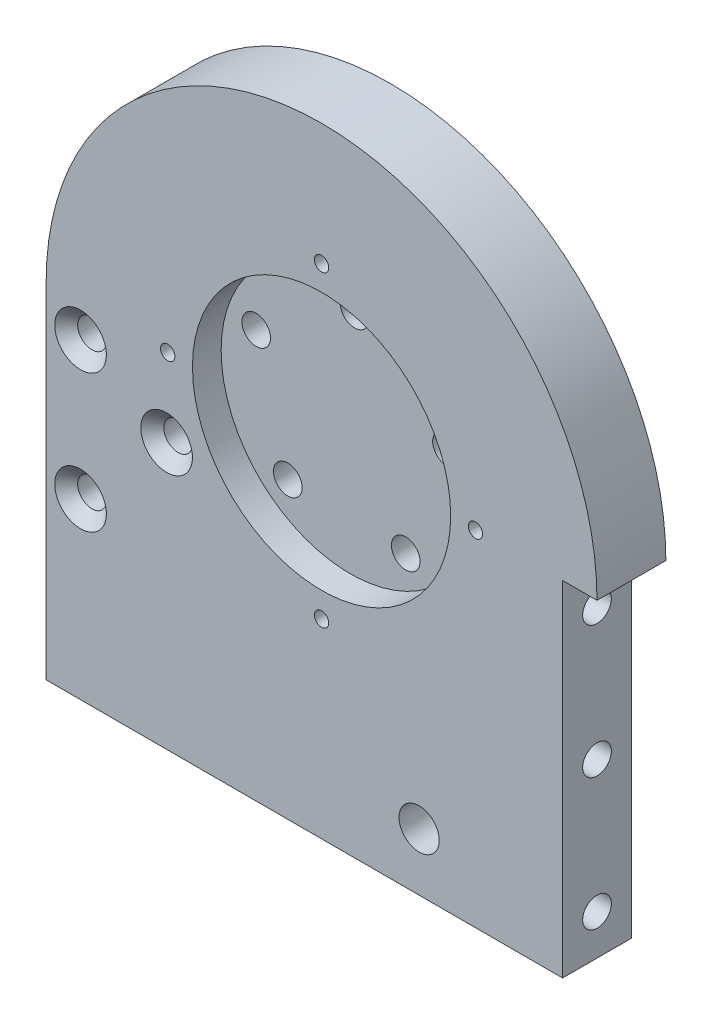
ISO-10303-21;
HEADER;
FILE_DESCRIPTION(('STEP AP214'),'2;1');
FILE_NAME('part.step','',(''),(''),'','','');
FILE_SCHEMA(('AUTOMOTIVE_DESIGN { 1 0 10303 214 1 1 1 1 }'));
ENDSEC;
DATA;
#1=APPLICATION_CONTEXT('core data for automotive mechanical design processes');
#2=APPLICATION_PROTOCOL_DEFINITION('international standard','automotive_design',2000,#1);
#3=PRODUCT_CONTEXT('',#1,'mechanical');
#4=PRODUCT('Part','Part','',(#3));
#5=PRODUCT_RELATED_PRODUCT_CATEGORY('part','',(#4));
#6=PRODUCT_DEFINITION_FORMATION('','',#4);
#7=PRODUCT_DEFINITION_CONTEXT('part definition',#1,'design');
#8=PRODUCT_DEFINITION('design','',#6,#7);
#9=PRODUCT_DEFINITION_SHAPE('','',#8);
#10=(LENGTH_UNIT() NAMED_UNIT(*) SI_UNIT(.MILLI.,.METRE.));
#11=(NAMED_UNIT(*) PLANE_ANGLE_UNIT() SI_UNIT($,.RADIAN.));
#12=(NAMED_UNIT(*) SI_UNIT($,.STERADIAN.) SOLID_ANGLE_UNIT());
#13=UNCERTAINTY_MEASURE_WITH_UNIT(LENGTH_MEASURE(1.E-05),#10,'distance_accuracy_value','');
#14=(GEOMETRIC_REPRESENTATION_CONTEXT(3) GLOBAL_UNCERTAINTY_ASSIGNED_CONTEXT((#13)) GLOBAL_UNIT_ASSIGNED_CONTEXT((#10,
#11,#12)) REPRESENTATION_CONTEXT('',''));
#15=CARTESIAN_POINT('',(0.,0.,0.));
#16=DIRECTION('',(0.,0.,1.));
#17=DIRECTION('',(1.,0.,0.));
#18=AXIS2_PLACEMENT_3D('',#15,#16,#17);
#19=CARTESIAN_POINT('',(2.99999999999998,30.,12.));
#20=DIRECTION('',(0.,0.,-1.));
#21=DIRECTION('',(-1.,0.,0.));
#22=AXIS2_PLACEMENT_3D('',#19,#20,#21);
#23=PLANE('',#22);
#24=CARTESIAN_POINT('',(20.,-20.,12.));
#25=DIRECTION('',(0.,0.,1.));
#26=DIRECTION('',(1.,0.,0.));
#27=AXIS2_PLACEMENT_3D('',#24,#25,#26);
#28=CIRCLE('',#27,3.5);
#29=CARTESIAN_POINT('',(23.5,-20.,12.));
#30=VERTEX_POINT('',#29);
#31=EDGE_CURVE('E134',#30,#30,#28,.T.);
#32=ORIENTED_EDGE('',*,*,#31,.F.);
#33=EDGE_LOOP('',(#32));
#34=FACE_BOUND('',#33,.T.);
#35=CARTESIAN_POINT('',(-23.8135681500049,29.9999999999999,12.));
#36=DIRECTION('',(0.,0.,1.));
#37=DIRECTION('',(0.,1.,0.));
#38=AXIS2_PLACEMENT_3D('',#35,#36,#37);
#39=CIRCLE('',#38,1.25);
#40=CARTESIAN_POINT('',(-23.813568150005,31.2499999999999,12.));
#41=VERTEX_POINT('',#40);
#42=EDGE_CURVE('E469',#41,#41,#39,.T.);
#43=ORIENTED_EDGE('',*,*,#42,.F.);
#44=EDGE_LOOP('',(#43));
#45=FACE_BOUND('',#44,.T.);
#46=CARTESIAN_POINT('',(2.99999999999998,3.18643184999511,12.));
#47=DIRECTION('',(0.,0.,1.));
#48=DIRECTION('',(-1.,0.,0.));
#49=AXIS2_PLACEMENT_3D('',#46,#47,#48);
#50=CIRCLE('',#49,1.25);
#51=CARTESIAN_POINT('',(1.74999999999998,3.18643184999511,12.));
#52=VERTEX_POINT('',#51);
#53=EDGE_CURVE('E475',#52,#52,#50,.T.);
#54=ORIENTED_EDGE('',*,*,#53,.F.);
#55=EDGE_LOOP('',(#54));
#56=FACE_BOUND('',#55,.T.);
#57=CARTESIAN_POINT('',(29.8135681500049,30.0000000000003,12.));
#58=DIRECTION('',(0.,0.,1.));
#59=DIRECTION('',(0.,-1.,0.));
#60=AXIS2_PLACEMENT_3D('',#57,#58,#59);
#61=CIRCLE('',#60,1.25);
#62=CARTESIAN_POINT('',(29.8135681500049,28.7500000000003,12.));
#63=VERTEX_POINT('',#62);
#64=EDGE_CURVE('E133',#63,#63,#61,.T.);
#65=ORIENTED_EDGE('',*,*,#64,.F.);
#66=EDGE_LOOP('',(#65));
#67=FACE_BOUND('',#66,.T.);
#68=CARTESIAN_POINT('',(2.99999999999998,56.8135681500049,12.));
#69=DIRECTION('',(0.,0.,1.));
#70=DIRECTION('',(1.,0.,0.));
#71=AXIS2_PLACEMENT_3D('',#68,#69,#70);
#72=CIRCLE('',#71,1.25);
#73=CARTESIAN_POINT('',(4.24999999999998,56.8135681500049,12.));
#74=VERTEX_POINT('',#73);
#75=EDGE_CURVE('E468',#74,#74,#72,.T.);
#76=ORIENTED_EDGE('',*,*,#75,.F.);
#77=EDGE_LOOP('',(#76));
#78=FACE_BOUND('',#77,.T.);
#79=CARTESIAN_POINT('',(2.99999999999998,30.,12.));
#80=DIRECTION('',(0.,0.,1.));
#81=DIRECTION('',(1.,0.,0.));
#82=AXIS2_PLACEMENT_3D('',#79,#80,#81);
#83=CIRCLE('',#82,22.5);
#84=CARTESIAN_POINT('',(25.5,30.,12.));
#85=VERTEX_POINT('',#84);
#86=EDGE_CURVE('E516',#85,#85,#83,.T.);
#87=ORIENTED_EDGE('',*,*,#86,.F.);
#88=EDGE_LOOP('',(#87));
#89=FACE_BOUND('',#88,.T.);
#90=DIRECTION('',(0.,1.,0.));
#91=VECTOR('',#90,1.);
#92=CARTESIAN_POINT('',(45.,-30.,12.));
#93=LINE('',#92,#91);
#94=CARTESIAN_POINT('',(45.,-30.,12.));
#95=VERTEX_POINT('',#94);
#96=CARTESIAN_POINT('',(45.,30.,12.));
#97=VERTEX_POINT('',#96);
#98=EDGE_CURVE('E125',#95,#97,#93,.T.);
#99=ORIENTED_EDGE('',*,*,#98,.T.);
#100=DIRECTION('',(1.,0.,0.));
#101=VECTOR('',#100,1.);
#102=CARTESIAN_POINT('',(45.,30.,12.));
#103=LINE('',#102,#101);
#104=CARTESIAN_POINT('',(51.,30.,12.));
#105=VERTEX_POINT('',#104);
#106=EDGE_CURVE('E91',#97,#105,#103,.T.);
#107=ORIENTED_EDGE('',*,*,#106,.T.);
#108=CARTESIAN_POINT('',(2.99999999999998,30.,12.));
#109=DIRECTION('',(0.,0.,1.));
#110=DIRECTION('',(-1.,0.,0.));
#111=AXIS2_PLACEMENT_3D('',#108,#109,#110);
#112=CIRCLE('',#111,48.);
#113=CARTESIAN_POINT('',(-45.,30.,12.));
#114=VERTEX_POINT('',#113);
#115=EDGE_CURVE('E95',#105,#114,#112,.T.);
#116=ORIENTED_EDGE('',*,*,#115,.T.);
#117=DIRECTION('',(0.,-1.,0.));
#118=VECTOR('',#117,1.);
#119=CARTESIAN_POINT('',(-45.,-30.,12.));
#120=LINE('',#119,#118);
#121=CARTESIAN_POINT('',(-45.,-30.,12.));
#122=VERTEX_POINT('',#121);
#123=EDGE_CURVE('E99',#114,#122,#120,.T.);
#124=ORIENTED_EDGE('',*,*,#123,.T.);
#125=DIRECTION('',(1.,0.,0.));
#126=VECTOR('',#125,1.);
#127=CARTESIAN_POINT('',(-45.,-30.,12.));
#128=LINE('',#127,#126);
#129=EDGE_CURVE('E56',#122,#95,#128,.T.);
#130=ORIENTED_EDGE('',*,*,#129,.T.);
#131=EDGE_LOOP('',(#99,#107,#116,#124,#130));
#132=FACE_BOUND('',#131,.T.);
#133=CARTESIAN_POINT('',(-24.,16.3,12.));
#134=DIRECTION('',(0.,0.,1.));
#135=DIRECTION('',(1.,0.,0.));
#136=AXIS2_PLACEMENT_3D('',#133,#134,#135);
#137=CIRCLE('',#136,4.5);
#138=CARTESIAN_POINT('',(-19.5,16.3,12.));
#139=VERTEX_POINT('',#138);
#140=EDGE_CURVE('E430',#139,#139,#137,.T.);
#141=ORIENTED_EDGE('',*,*,#140,.F.);
#142=EDGE_LOOP('',(#141));
#143=FACE_BOUND('',#142,.T.);
#144=CARTESIAN_POINT('',(-39.,0.299999999999988,12.));
#145=DIRECTION('',(0.,0.,1.));
#146=DIRECTION('',(1.,0.,0.));
#147=AXIS2_PLACEMENT_3D('',#144,#145,#146);
#148=CIRCLE('',#147,4.5);
#149=CARTESIAN_POINT('',(-34.5,0.299999999999988,12.));
#150=VERTEX_POINT('',#149);
#151=EDGE_CURVE('E421',#150,#150,#148,.T.);
#152=ORIENTED_EDGE('',*,*,#151,.F.);
#153=EDGE_LOOP('',(#152));
#154=FACE_BOUND('',#153,.T.);
#155=CARTESIAN_POINT('',(-39.,24.3,12.));
#156=DIRECTION('',(0.,0.,1.));
#157=DIRECTION('',(1.,0.,0.));
#158=AXIS2_PLACEMENT_3D('',#155,#156,#157);
#159=CIRCLE('',#158,4.5);
#160=CARTESIAN_POINT('',(-34.5,24.3,12.));
#161=VERTEX_POINT('',#160);
#162=EDGE_CURVE('E413',#161,#161,#159,.T.);
#163=ORIENTED_EDGE('',*,*,#162,.F.);
#164=EDGE_LOOP('',(#163));
#165=FACE_BOUND('',#164,.T.);
#166=ADVANCED_FACE('F39',(#34,#45,#56,#67,#78,#89,#132,#143,#154,#165),#23,.F.);
#167=CARTESIAN_POINT('',(37.,23.,6.));
#168=DIRECTION('',(1.,0.,0.));
#169=DIRECTION('',(0.,0.,-1.));
#170=AXIS2_PLACEMENT_3D('',#167,#168,#169);
#171=PLANE('',#170);
#172=CARTESIAN_POINT('',(37.,23.,6.));
#173=DIRECTION('',(1.,0.,0.));
#174=DIRECTION('',(0.,0.,-1.));
#175=AXIS2_PLACEMENT_3D('',#172,#173,#174);
#176=CIRCLE('',#175,2.5);
#177=CARTESIAN_POINT('',(37.,23.,3.5));
#178=VERTEX_POINT('',#177);
#179=EDGE_CURVE('E11',#178,#178,#176,.T.);
#180=ORIENTED_EDGE('',*,*,#179,.T.);
#181=EDGE_LOOP('',(#180));
#182=FACE_BOUND('',#181,.T.);
#183=ADVANCED_FACE('F41',(#182),#171,.T.);
#184=CARTESIAN_POINT('',(37.,23.,6.));
#185=DIRECTION('',(1.,0.,0.));
#186=DIRECTION('',(0.,0.,-1.));
#187=AXIS2_PLACEMENT_3D('',#184,#185,#186);
#188=CYLINDRICAL_SURFACE('',#187,2.5);
#189=ORIENTED_EDGE('',*,*,#179,.F.);
#190=EDGE_LOOP('',(#189));
#191=FACE_BOUND('',#190,.T.);
#192=CARTESIAN_POINT('',(45.,23.,6.));
#193=DIRECTION('',(1.,0.,0.));
#194=DIRECTION('',(0.,0.,-1.));
#195=AXIS2_PLACEMENT_3D('',#192,#193,#194);
#196=CIRCLE('',#195,2.5);
#197=CARTESIAN_POINT('',(45.,23.,3.5));
#198=VERTEX_POINT('',#197);
#199=EDGE_CURVE('E48',#198,#198,#196,.T.);
#200=ORIENTED_EDGE('',*,*,#199,.T.);
#201=EDGE_LOOP('',(#200));
#202=FACE_BOUND('',#201,.T.);
#203=ADVANCED_FACE('F138',(#191,#202),#188,.F.);
#204=CARTESIAN_POINT('',(45.,-30.,12.));
#205=DIRECTION('',(-1.,0.,0.));
#206=DIRECTION('',(0.,0.,1.));
#207=AXIS2_PLACEMENT_3D('',#204,#205,#206);
#208=PLANE('',#207);
#209=CARTESIAN_POINT('',(45.,0.,6.));
#210=DIRECTION('',(1.,0.,0.));
#211=DIRECTION('',(0.,0.,-1.));
#212=AXIS2_PLACEMENT_3D('',#209,#210,#211);
#213=CIRCLE('',#212,2.5);
#214=CARTESIAN_POINT('',(45.,0.,3.5));
#215=VERTEX_POINT('',#214);
#216=EDGE_CURVE('E439',#215,#215,#213,.T.);
#217=ORIENTED_EDGE('',*,*,#216,.F.);
#218=EDGE_LOOP('',(#217));
#219=FACE_BOUND('',#218,.T.);
#220=CARTESIAN_POINT('',(45.,-23.,6.));
#221=DIRECTION('',(1.,0.,0.));
#222=DIRECTION('',(0.,0.,-1.));
#223=AXIS2_PLACEMENT_3D('',#220,#221,#222);
#224=CIRCLE('',#223,2.5);
#225=CARTESIAN_POINT('',(45.,-23.,3.5));
#226=VERTEX_POINT('',#225);
#227=EDGE_CURVE('E445',#226,#226,#224,.T.);
#228=ORIENTED_EDGE('',*,*,#227,.F.);
#229=EDGE_LOOP('',(#228));
#230=FACE_BOUND('',#229,.T.);
#231=DIRECTION('',(0.,1.,0.));
#232=VECTOR('',#231,1.);
#233=CARTESIAN_POINT('',(45.,-30.,0.));
#234=LINE('',#233,#232);
#235=CARTESIAN_POINT('',(45.,-30.,0.));
#236=VERTEX_POINT('',#235);
#237=CARTESIAN_POINT('',(45.,30.,0.));
#238=VERTEX_POINT('',#237);
#239=EDGE_CURVE('E116',#236,#238,#234,.T.);
#240=ORIENTED_EDGE('',*,*,#239,.T.);
#241=DIRECTION('',(0.,0.,-1.));
#242=VECTOR('',#241,1.);
#243=CARTESIAN_POINT('',(45.,30.,12.));
#244=LINE('',#243,#242);
#245=EDGE_CURVE('E129',#97,#238,#244,.T.);
#246=ORIENTED_EDGE('',*,*,#245,.F.);
#247=ORIENTED_EDGE('',*,*,#98,.F.);
#248=DIRECTION('',(0.,0.,-1.));
#249=VECTOR('',#248,1.);
#250=CARTESIAN_POINT('',(45.,-30.,12.));
#251=LINE('',#250,#249);
#252=EDGE_CURVE('E112',#95,#236,#251,.T.);
#253=ORIENTED_EDGE('',*,*,#252,.T.);
#254=EDGE_LOOP('',(#240,#246,#247,#253));
#255=FACE_BOUND('',#254,.T.);
#256=ORIENTED_EDGE('',*,*,#199,.F.);
#257=EDGE_LOOP('',(#256));
#258=FACE_BOUND('',#257,.T.);
#259=ADVANCED_FACE('F140',(#219,#230,#255,#258),#208,.F.);
#260=CARTESIAN_POINT('',(45.,30.,12.));
#261=DIRECTION('',(0.,1.,0.));
#262=DIRECTION('',(0.,0.,1.));
#263=AXIS2_PLACEMENT_3D('',#260,#261,#262);
#264=PLANE('',#263);
#265=DIRECTION('',(1.,0.,0.));
#266=VECTOR('',#265,1.);
#267=CARTESIAN_POINT('',(45.,30.,0.));
#268=LINE('',#267,#266);
#269=CARTESIAN_POINT('',(51.,30.,0.));
#270=VERTEX_POINT('',#269);
#271=EDGE_CURVE('E119',#238,#270,#268,.T.);
#272=ORIENTED_EDGE('',*,*,#271,.T.);
#273=DIRECTION('',(0.,0.,-1.));
#274=VECTOR('',#273,1.);
#275=CARTESIAN_POINT('',(51.,30.,12.));
#276=LINE('',#275,#274);
#277=EDGE_CURVE('E107',#105,#270,#276,.T.);
#278=ORIENTED_EDGE('',*,*,#277,.F.);
#279=ORIENTED_EDGE('',*,*,#106,.F.);
#280=ORIENTED_EDGE('',*,*,#245,.T.);
#281=EDGE_LOOP('',(#272,#278,#279,#280));
#282=FACE_BOUND('',#281,.T.);
#283=ADVANCED_FACE('F142',(#282),#264,.F.);
#284=CARTESIAN_POINT('',(2.99999999999998,30.,12.));
#285=DIRECTION('',(0.,0.,-1.));
#286=DIRECTION('',(-1.,0.,0.));
#287=AXIS2_PLACEMENT_3D('',#284,#285,#286);
#288=CYLINDRICAL_SURFACE('',#287,48.);
#289=CARTESIAN_POINT('',(2.99999999999998,30.,0.));
#290=DIRECTION('',(0.,0.,1.));
#291=DIRECTION('',(-1.,0.,0.));
#292=AXIS2_PLACEMENT_3D('',#289,#290,#291);
#293=CIRCLE('',#292,48.);
#294=CARTESIAN_POINT('',(-45.,30.,0.));
#295=VERTEX_POINT('',#294);
#296=EDGE_CURVE('E106',#270,#295,#293,.T.);
#297=ORIENTED_EDGE('',*,*,#296,.T.);
#298=DIRECTION('',(0.,0.,-1.));
#299=VECTOR('',#298,1.);
#300=CARTESIAN_POINT('',(-45.,30.,12.));
#301=LINE('',#300,#299);
#302=EDGE_CURVE('E103',#114,#295,#301,.T.);
#303=ORIENTED_EDGE('',*,*,#302,.F.);
#304=ORIENTED_EDGE('',*,*,#115,.F.);
#305=ORIENTED_EDGE('',*,*,#277,.T.);
#306=EDGE_LOOP('',(#297,#303,#304,#305));
#307=FACE_BOUND('',#306,.T.);
#308=ADVANCED_FACE('F104',(#307),#288,.T.);
#309=CARTESIAN_POINT('',(-45.,-30.,12.));
#310=DIRECTION('',(1.,0.,0.));
#311=DIRECTION('',(0.,0.,-1.));
#312=AXIS2_PLACEMENT_3D('',#309,#310,#311);
#313=PLANE('',#312);
#314=DIRECTION('',(0.,-1.,0.));
#315=VECTOR('',#314,1.);
#316=CARTESIAN_POINT('',(-45.,-30.,0.));
#317=LINE('',#316,#315);
#318=CARTESIAN_POINT('',(-45.,-30.,0.));
#319=VERTEX_POINT('',#318);
#320=EDGE_CURVE('E76',#295,#319,#317,.T.);
#321=ORIENTED_EDGE('',*,*,#320,.T.);
#322=DIRECTION('',(0.,0.,-1.));
#323=VECTOR('',#322,1.);
#324=CARTESIAN_POINT('',(-45.,-30.,12.));
#325=LINE('',#324,#323);
#326=EDGE_CURVE('E108',#122,#319,#325,.T.);
#327=ORIENTED_EDGE('',*,*,#326,.F.);
#328=ORIENTED_EDGE('',*,*,#123,.F.);
#329=ORIENTED_EDGE('',*,*,#302,.T.);
#330=EDGE_LOOP('',(#321,#327,#328,#329));
#331=FACE_BOUND('',#330,.T.);
#332=ADVANCED_FACE('F110',(#331),#313,.F.);
#333=CARTESIAN_POINT('',(-45.,-30.,12.));
#334=DIRECTION('',(0.,1.,0.));
#335=DIRECTION('',(0.,0.,1.));
#336=AXIS2_PLACEMENT_3D('',#333,#334,#335);
#337=PLANE('',#336);
#338=CARTESIAN_POINT('',(-8.5,-30.,5.2));
#339=DIRECTION('',(0.,-1.,0.));
#340=DIRECTION('',(0.,0.,-1.));
#341=AXIS2_PLACEMENT_3D('',#338,#339,#340);
#342=CIRCLE('',#341,3.25);
#343=CARTESIAN_POINT('',(-8.5,-30.,1.95));
#344=VERTEX_POINT('',#343);
#345=EDGE_CURVE('E449',#344,#344,#342,.T.);
#346=ORIENTED_EDGE('',*,*,#345,.F.);
#347=EDGE_LOOP('',(#346));
#348=FACE_BOUND('',#347,.T.);
#349=CARTESIAN_POINT('',(-36.7,-30.,5.2));
#350=DIRECTION('',(0.,-1.,0.));
#351=DIRECTION('',(0.,0.,-1.));
#352=AXIS2_PLACEMENT_3D('',#349,#350,#351);
#353=CIRCLE('',#352,3.25);
#354=CARTESIAN_POINT('',(-36.7,-30.,1.95));
#355=VERTEX_POINT('',#354);
#356=EDGE_CURVE('E455',#355,#355,#353,.T.);
#357=ORIENTED_EDGE('',*,*,#356,.F.);
#358=EDGE_LOOP('',(#357));
#359=FACE_BOUND('',#358,.T.);
#360=DIRECTION('',(1.,0.,0.));
#361=VECTOR('',#360,1.);
#362=CARTESIAN_POINT('',(-45.,-30.,0.));
#363=LINE('',#362,#361);
#364=EDGE_CURVE('E82',#319,#236,#363,.T.);
#365=ORIENTED_EDGE('',*,*,#364,.T.);
#366=ORIENTED_EDGE('',*,*,#252,.F.);
#367=ORIENTED_EDGE('',*,*,#129,.F.);
#368=ORIENTED_EDGE('',*,*,#326,.T.);
#369=EDGE_LOOP('',(#365,#366,#367,#368));
#370=FACE_BOUND('',#369,.T.);
#371=ADVANCED_FACE('F171',(#348,#359,#370),#337,.F.);
#372=CARTESIAN_POINT('',(2.99999999999998,30.,0.));
#373=DIRECTION('',(0.,0.,-1.));
#374=DIRECTION('',(-1.,0.,0.));
#375=AXIS2_PLACEMENT_3D('',#372,#373,#374);
#376=PLANE('',#375);
#377=CARTESIAN_POINT('',(-39.,24.3,0.));
#378=DIRECTION('',(0.,0.,-1.));
#379=DIRECTION('',(-1.,0.,0.));
#380=AXIS2_PLACEMENT_3D('',#377,#378,#379);
#381=CIRCLE('',#380,2.5);
#382=CARTESIAN_POINT('',(-41.5,24.3,0.));
#383=VERTEX_POINT('',#382);
#384=EDGE_CURVE('E416',#383,#383,#381,.T.);
#385=ORIENTED_EDGE('',*,*,#384,.F.);
#386=EDGE_LOOP('',(#385));
#387=FACE_BOUND('',#386,.T.);
#388=CARTESIAN_POINT('',(-39.,0.299999999999988,0.));
#389=DIRECTION('',(0.,0.,-1.));
#390=DIRECTION('',(-1.,0.,0.));
#391=AXIS2_PLACEMENT_3D('',#388,#389,#390);
#392=CIRCLE('',#391,2.5);
#393=CARTESIAN_POINT('',(-41.5,0.299999999999988,0.));
#394=VERTEX_POINT('',#393);
#395=EDGE_CURVE('E427',#394,#394,#392,.T.);
#396=ORIENTED_EDGE('',*,*,#395,.F.);
#397=EDGE_LOOP('',(#396));
#398=FACE_BOUND('',#397,.T.);
#399=CARTESIAN_POINT('',(-24.,16.3,0.));
#400=DIRECTION('',(0.,0.,-1.));
#401=DIRECTION('',(-1.,0.,0.));
#402=AXIS2_PLACEMENT_3D('',#399,#400,#401);
#403=CIRCLE('',#402,2.5);
#404=CARTESIAN_POINT('',(-26.5,16.3,0.));
#405=VERTEX_POINT('',#404);
#406=EDGE_CURVE('E436',#405,#405,#403,.T.);
#407=ORIENTED_EDGE('',*,*,#406,.F.);
#408=EDGE_LOOP('',(#407));
#409=FACE_BOUND('',#408,.T.);
#410=CARTESIAN_POINT('',(20.,-20.,0.));
#411=DIRECTION('',(0.,0.,-1.));
#412=DIRECTION('',(-1.,0.,0.));
#413=AXIS2_PLACEMENT_3D('',#410,#411,#412);
#414=CIRCLE('',#413,3.5);
#415=CARTESIAN_POINT('',(16.5,-20.,0.));
#416=VERTEX_POINT('',#415);
#417=EDGE_CURVE('E131',#416,#416,#414,.T.);
#418=ORIENTED_EDGE('',*,*,#417,.F.);
#419=EDGE_LOOP('',(#418));
#420=FACE_BOUND('',#419,.T.);
#421=CARTESIAN_POINT('',(-23.8135681500049,29.9999999999999,0.));
#422=DIRECTION('',(0.,0.,1.));
#423=DIRECTION('',(0.,1.,0.));
#424=AXIS2_PLACEMENT_3D('',#421,#422,#423);
#425=CIRCLE('',#424,1.25);
#426=CARTESIAN_POINT('',(-23.813568150005,31.2499999999999,0.));
#427=VERTEX_POINT('',#426);
#428=EDGE_CURVE('E465',#427,#427,#425,.T.);
#429=ORIENTED_EDGE('',*,*,#428,.T.);
#430=EDGE_LOOP('',(#429));
#431=FACE_BOUND('',#430,.T.);
#432=CARTESIAN_POINT('',(2.99999999999998,3.18643184999511,0.));
#433=DIRECTION('',(0.,0.,1.));
#434=DIRECTION('',(-1.,0.,0.));
#435=AXIS2_PLACEMENT_3D('',#432,#433,#434);
#436=CIRCLE('',#435,1.25);
#437=CARTESIAN_POINT('',(1.74999999999998,3.18643184999511,0.));
#438=VERTEX_POINT('',#437);
#439=EDGE_CURVE('E472',#438,#438,#436,.T.);
#440=ORIENTED_EDGE('',*,*,#439,.T.);
#441=EDGE_LOOP('',(#440));
#442=FACE_BOUND('',#441,.T.);
#443=CARTESIAN_POINT('',(29.8135681500049,30.0000000000003,0.));
#444=DIRECTION('',(0.,0.,1.));
#445=DIRECTION('',(0.,-1.,0.));
#446=AXIS2_PLACEMENT_3D('',#443,#444,#445);
#447=CIRCLE('',#446,1.25);
#448=CARTESIAN_POINT('',(29.8135681500049,28.7500000000003,0.));
#449=VERTEX_POINT('',#448);
#450=EDGE_CURVE('E478',#449,#449,#447,.T.);
#451=ORIENTED_EDGE('',*,*,#450,.T.);
#452=EDGE_LOOP('',(#451));
#453=FACE_BOUND('',#452,.T.);
#454=CARTESIAN_POINT('',(2.99999999999998,56.8135681500049,0.));
#455=DIRECTION('',(0.,0.,1.));
#456=DIRECTION('',(1.,0.,0.));
#457=AXIS2_PLACEMENT_3D('',#454,#455,#456);
#458=CIRCLE('',#457,1.25);
#459=CARTESIAN_POINT('',(4.24999999999998,56.8135681500049,0.));
#460=VERTEX_POINT('',#459);
#461=EDGE_CURVE('E483',#460,#460,#458,.T.);
#462=ORIENTED_EDGE('',*,*,#461,.T.);
#463=EDGE_LOOP('',(#462));
#464=FACE_BOUND('',#463,.T.);
#465=CARTESIAN_POINT('',(-13.3958585694437,36.1176647318074,0.));
#466=DIRECTION('',(0.,0.,1.));
#467=DIRECTION('',(0.309016994374945,0.951056516295155,0.));
#468=AXIS2_PLACEMENT_3D('',#465,#466,#467);
#469=CIRCLE('',#468,2.5);
#470=CARTESIAN_POINT('',(-12.6233160835063,38.4953060225453,0.));
#471=VERTEX_POINT('',#470);
#472=EDGE_CURVE('E489',#471,#471,#469,.T.);
#473=ORIENTED_EDGE('',*,*,#472,.T.);
#474=EDGE_LOOP('',(#473));
#475=FACE_BOUND('',#474,.T.);
#476=CARTESIAN_POINT('',(-7.88484384302066,16.2970742352936,0.));
#477=DIRECTION('',(0.,0.,1.));
#478=DIRECTION('',(-0.809016994374951,0.587785252292469,0.));
#479=AXIS2_PLACEMENT_3D('',#476,#477,#478);
#480=CIRCLE('',#479,2.5);
#481=CARTESIAN_POINT('',(-9.90738632895804,17.7665373660248,0.));
#482=VERTEX_POINT('',#481);
#483=EDGE_CURVE('E496',#482,#482,#480,.T.);
#484=ORIENTED_EDGE('',*,*,#483,.T.);
#485=EDGE_LOOP('',(#484));
#486=FACE_BOUND('',#485,.T.);
#487=CARTESIAN_POINT('',(12.668655112222,15.4134614002875,0.));
#488=DIRECTION('',(0.,0.,1.));
#489=DIRECTION('',(-0.809016994374942,-0.58778525229248,0.));
#490=AXIS2_PLACEMENT_3D('',#487,#488,#489);
#491=CIRCLE('',#490,2.5);
#492=CARTESIAN_POINT('',(10.6461126262846,13.9439982695563,0.));
#493=VERTEX_POINT('',#492);
#494=EDGE_CURVE('E502',#493,#493,#491,.T.);
#495=ORIENTED_EDGE('',*,*,#494,.T.);
#496=EDGE_LOOP('',(#495));
#497=FACE_BOUND('',#496,.T.);
#498=CARTESIAN_POINT('',(19.8604013278742,34.6879491318719,0.));
#499=DIRECTION('',(0.,0.,1.));
#500=DIRECTION('',(0.309016994374958,-0.95105651629515,0.));
#501=AXIS2_PLACEMENT_3D('',#498,#499,#500);
#502=CIRCLE('',#501,2.5);
#503=CARTESIAN_POINT('',(20.6329438138116,32.310307841134,0.));
#504=VERTEX_POINT('',#503);
#505=EDGE_CURVE('E508',#504,#504,#502,.T.);
#506=ORIENTED_EDGE('',*,*,#505,.T.);
#507=EDGE_LOOP('',(#506));
#508=FACE_BOUND('',#507,.T.);
#509=CARTESIAN_POINT('',(3.75164597236828,47.4838505007399,0.));
#510=DIRECTION('',(0.,0.,1.));
#511=DIRECTION('',(1.,0.,0.));
#512=AXIS2_PLACEMENT_3D('',#509,#510,#511);
#513=CIRCLE('',#512,2.5);
#514=CARTESIAN_POINT('',(6.25164597236828,47.4838505007399,0.));
#515=VERTEX_POINT('',#514);
#516=EDGE_CURVE('E513',#515,#515,#513,.T.);
#517=ORIENTED_EDGE('',*,*,#516,.T.);
#518=EDGE_LOOP('',(#517));
#519=FACE_BOUND('',#518,.T.);
#520=ORIENTED_EDGE('',*,*,#239,.F.);
#521=ORIENTED_EDGE('',*,*,#364,.F.);
#522=ORIENTED_EDGE('',*,*,#320,.F.);
#523=ORIENTED_EDGE('',*,*,#296,.F.);
#524=ORIENTED_EDGE('',*,*,#271,.F.);
#525=EDGE_LOOP('',(#520,#521,#522,#523,#524));
#526=FACE_BOUND('',#525,.T.);
#527=ADVANCED_FACE('F169',(#387,#398,#409,#420,#431,#442,#453,#464,#475,#486,#497,#508,#519,
#526),#376,.T.);
#528=CARTESIAN_POINT('',(2.99999999999998,30.,7.));
#529=DIRECTION('',(0.,0.,1.));
#530=DIRECTION('',(1.,0.,0.));
#531=AXIS2_PLACEMENT_3D('',#528,#529,#530);
#532=CYLINDRICAL_SURFACE('',#531,22.5);
#533=CARTESIAN_POINT('',(2.99999999999998,30.,7.));
#534=DIRECTION('',(0.,0.,1.));
#535=DIRECTION('',(1.,0.,0.));
#536=AXIS2_PLACEMENT_3D('',#533,#534,#535);
#537=CIRCLE('',#536,22.5);
#538=CARTESIAN_POINT('',(25.5,30.,7.));
#539=VERTEX_POINT('',#538);
#540=EDGE_CURVE('E120',#539,#539,#537,.T.);
#541=ORIENTED_EDGE('',*,*,#540,.F.);
#542=EDGE_LOOP('',(#541));
#543=FACE_BOUND('',#542,.T.);
#544=ORIENTED_EDGE('',*,*,#86,.T.);
#545=EDGE_LOOP('',(#544));
#546=FACE_BOUND('',#545,.T.);
#547=ADVANCED_FACE('F167',(#543,#546),#532,.F.);
#548=CARTESIAN_POINT('',(2.99999999999998,30.,7.));
#549=DIRECTION('',(0.,0.,1.));
#550=DIRECTION('',(1.,0.,0.));
#551=AXIS2_PLACEMENT_3D('',#548,#549,#550);
#552=PLANE('',#551);
#553=CARTESIAN_POINT('',(-13.3958585694437,36.1176647318074,7.));
#554=DIRECTION('',(0.,0.,1.));
#555=DIRECTION('',(0.309016994374945,0.951056516295155,0.));
#556=AXIS2_PLACEMENT_3D('',#553,#554,#555);
#557=CIRCLE('',#556,2.5);
#558=CARTESIAN_POINT('',(-12.6233160835063,38.4953060225453,7.));
#559=VERTEX_POINT('',#558);
#560=EDGE_CURVE('E493',#559,#559,#557,.T.);
#561=ORIENTED_EDGE('',*,*,#560,.F.);
#562=EDGE_LOOP('',(#561));
#563=FACE_BOUND('',#562,.T.);
#564=CARTESIAN_POINT('',(-7.88484384302066,16.2970742352936,7.));
#565=DIRECTION('',(0.,0.,1.));
#566=DIRECTION('',(-0.809016994374951,0.587785252292469,0.));
#567=AXIS2_PLACEMENT_3D('',#564,#565,#566);
#568=CIRCLE('',#567,2.5);
#569=CARTESIAN_POINT('',(-9.90738632895804,17.7665373660248,7.));
#570=VERTEX_POINT('',#569);
#571=EDGE_CURVE('E499',#570,#570,#568,.T.);
#572=ORIENTED_EDGE('',*,*,#571,.F.);
#573=EDGE_LOOP('',(#572));
#574=FACE_BOUND('',#573,.T.);
#575=CARTESIAN_POINT('',(12.668655112222,15.4134614002875,7.));
#576=DIRECTION('',(0.,0.,1.));
#577=DIRECTION('',(-0.809016994374942,-0.58778525229248,0.));
#578=AXIS2_PLACEMENT_3D('',#575,#576,#577);
#579=CIRCLE('',#578,2.5);
#580=CARTESIAN_POINT('',(10.6461126262846,13.9439982695563,7.));
#581=VERTEX_POINT('',#580);
#582=EDGE_CURVE('E505',#581,#581,#579,.T.);
#583=ORIENTED_EDGE('',*,*,#582,.F.);
#584=EDGE_LOOP('',(#583));
#585=FACE_BOUND('',#584,.T.);
#586=CARTESIAN_POINT('',(19.8604013278742,34.6879491318719,7.));
#587=DIRECTION('',(0.,0.,1.));
#588=DIRECTION('',(0.309016994374958,-0.95105651629515,0.));
#589=AXIS2_PLACEMENT_3D('',#586,#587,#588);
#590=CIRCLE('',#589,2.5);
#591=CARTESIAN_POINT('',(20.6329438138116,32.310307841134,7.));
#592=VERTEX_POINT('',#591);
#593=EDGE_CURVE('E486',#592,#592,#590,.T.);
#594=ORIENTED_EDGE('',*,*,#593,.F.);
#595=EDGE_LOOP('',(#594));
#596=FACE_BOUND('',#595,.T.);
#597=CARTESIAN_POINT('',(3.75164597236828,47.4838505007399,7.));
#598=DIRECTION('',(0.,0.,1.));
#599=DIRECTION('',(1.,0.,0.));
#600=AXIS2_PLACEMENT_3D('',#597,#598,#599);
#601=CIRCLE('',#600,2.5);
#602=CARTESIAN_POINT('',(6.25164597236828,47.4838505007399,7.));
#603=VERTEX_POINT('',#602);
#604=EDGE_CURVE('E492',#603,#603,#601,.T.);
#605=ORIENTED_EDGE('',*,*,#604,.F.);
#606=EDGE_LOOP('',(#605));
#607=FACE_BOUND('',#606,.T.);
#608=ORIENTED_EDGE('',*,*,#540,.T.);
#609=EDGE_LOOP('',(#608));
#610=FACE_BOUND('',#609,.T.);
#611=ADVANCED_FACE('F194',(#563,#574,#585,#596,#607,#610),#552,.T.);
#612=CARTESIAN_POINT('',(3.75164597236828,47.4838505007399,0.));
#613=DIRECTION('',(0.,0.,1.));
#614=DIRECTION('',(1.,0.,0.));
#615=AXIS2_PLACEMENT_3D('',#612,#613,#614);
#616=CYLINDRICAL_SURFACE('',#615,2.5);
#617=ORIENTED_EDGE('',*,*,#516,.F.);
#618=EDGE_LOOP('',(#617));
#619=FACE_BOUND('',#618,.T.);
#620=ORIENTED_EDGE('',*,*,#604,.T.);
#621=EDGE_LOOP('',(#620));
#622=FACE_BOUND('',#621,.T.);
#623=ADVANCED_FACE('F200',(#619,#622),#616,.F.);
#624=CARTESIAN_POINT('',(19.8604013278742,34.6879491318719,0.));
#625=DIRECTION('',(0.,0.,1.));
#626=DIRECTION('',(1.,0.,0.));
#627=AXIS2_PLACEMENT_3D('',#624,#625,#626);
#628=CYLINDRICAL_SURFACE('',#627,2.5);
#629=ORIENTED_EDGE('',*,*,#505,.F.);
#630=EDGE_LOOP('',(#629));
#631=FACE_BOUND('',#630,.T.);
#632=ORIENTED_EDGE('',*,*,#593,.T.);
#633=EDGE_LOOP('',(#632));
#634=FACE_BOUND('',#633,.T.);
#635=ADVANCED_FACE('F204',(#631,#634),#628,.F.);
#636=CARTESIAN_POINT('',(12.668655112222,15.4134614002875,0.));
#637=DIRECTION('',(0.,0.,1.));
#638=DIRECTION('',(1.,0.,0.));
#639=AXIS2_PLACEMENT_3D('',#636,#637,#638);
#640=CYLINDRICAL_SURFACE('',#639,2.5);
#641=ORIENTED_EDGE('',*,*,#494,.F.);
#642=EDGE_LOOP('',(#641));
#643=FACE_BOUND('',#642,.T.);
#644=ORIENTED_EDGE('',*,*,#582,.T.);
#645=EDGE_LOOP('',(#644));
#646=FACE_BOUND('',#645,.T.);
#647=ADVANCED_FACE('F217',(#643,#646),#640,.F.);
#648=CARTESIAN_POINT('',(-7.88484384302066,16.2970742352936,0.));
#649=DIRECTION('',(0.,0.,1.));
#650=DIRECTION('',(1.,0.,0.));
#651=AXIS2_PLACEMENT_3D('',#648,#649,#650);
#652=CYLINDRICAL_SURFACE('',#651,2.5);
#653=ORIENTED_EDGE('',*,*,#483,.F.);
#654=EDGE_LOOP('',(#653));
#655=FACE_BOUND('',#654,.T.);
#656=ORIENTED_EDGE('',*,*,#571,.T.);
#657=EDGE_LOOP('',(#656));
#658=FACE_BOUND('',#657,.T.);
#659=ADVANCED_FACE('F225',(#655,#658),#652,.F.);
#660=CARTESIAN_POINT('',(-13.3958585694437,36.1176647318074,0.));
#661=DIRECTION('',(0.,0.,1.));
#662=DIRECTION('',(1.,0.,0.));
#663=AXIS2_PLACEMENT_3D('',#660,#661,#662);
#664=CYLINDRICAL_SURFACE('',#663,2.5);
#665=ORIENTED_EDGE('',*,*,#472,.F.);
#666=EDGE_LOOP('',(#665));
#667=FACE_BOUND('',#666,.T.);
#668=ORIENTED_EDGE('',*,*,#560,.T.);
#669=EDGE_LOOP('',(#668));
#670=FACE_BOUND('',#669,.T.);
#671=ADVANCED_FACE('F233',(#667,#670),#664,.F.);
#672=CARTESIAN_POINT('',(2.99999999999998,56.8135681500049,0.));
#673=DIRECTION('',(0.,0.,1.));
#674=DIRECTION('',(1.,0.,0.));
#675=AXIS2_PLACEMENT_3D('',#672,#673,#674);
#676=CYLINDRICAL_SURFACE('',#675,1.25);
#677=ORIENTED_EDGE('',*,*,#461,.F.);
#678=EDGE_LOOP('',(#677));
#679=FACE_BOUND('',#678,.T.);
#680=ORIENTED_EDGE('',*,*,#75,.T.);
#681=EDGE_LOOP('',(#680));
#682=FACE_BOUND('',#681,.T.);
#683=ADVANCED_FACE('F241',(#679,#682),#676,.F.);
#684=CARTESIAN_POINT('',(29.8135681500049,30.0000000000003,0.));
#685=DIRECTION('',(0.,0.,1.));
#686=DIRECTION('',(1.,0.,0.));
#687=AXIS2_PLACEMENT_3D('',#684,#685,#686);
#688=CYLINDRICAL_SURFACE('',#687,1.25);
#689=ORIENTED_EDGE('',*,*,#450,.F.);
#690=EDGE_LOOP('',(#689));
#691=FACE_BOUND('',#690,.T.);
#692=ORIENTED_EDGE('',*,*,#64,.T.);
#693=EDGE_LOOP('',(#692));
#694=FACE_BOUND('',#693,.T.);
#695=ADVANCED_FACE('F249',(#691,#694),#688,.F.);
#696=CARTESIAN_POINT('',(2.99999999999998,3.18643184999511,0.));
#697=DIRECTION('',(0.,0.,1.));
#698=DIRECTION('',(1.,0.,0.));
#699=AXIS2_PLACEMENT_3D('',#696,#697,#698);
#700=CYLINDRICAL_SURFACE('',#699,1.25);
#701=ORIENTED_EDGE('',*,*,#439,.F.);
#702=EDGE_LOOP('',(#701));
#703=FACE_BOUND('',#702,.T.);
#704=ORIENTED_EDGE('',*,*,#53,.T.);
#705=EDGE_LOOP('',(#704));
#706=FACE_BOUND('',#705,.T.);
#707=ADVANCED_FACE('F257',(#703,#706),#700,.F.);
#708=CARTESIAN_POINT('',(-23.8135681500049,29.9999999999999,0.));
#709=DIRECTION('',(0.,0.,1.));
#710=DIRECTION('',(1.,0.,0.));
#711=AXIS2_PLACEMENT_3D('',#708,#709,#710);
#712=CYLINDRICAL_SURFACE('',#711,1.25);
#713=ORIENTED_EDGE('',*,*,#428,.F.);
#714=EDGE_LOOP('',(#713));
#715=FACE_BOUND('',#714,.T.);
#716=ORIENTED_EDGE('',*,*,#42,.T.);
#717=EDGE_LOOP('',(#716));
#718=FACE_BOUND('',#717,.T.);
#719=ADVANCED_FACE('F265',(#715,#718),#712,.F.);
#720=CARTESIAN_POINT('',(20.,-20.,-2.5));
#721=DIRECTION('',(0.,0.,1.));
#722=DIRECTION('',(1.,0.,0.));
#723=AXIS2_PLACEMENT_3D('',#720,#721,#722);
#724=CYLINDRICAL_SURFACE('',#723,3.5);
#725=ORIENTED_EDGE('',*,*,#417,.T.);
#726=EDGE_LOOP('',(#725));
#727=FACE_BOUND('',#726,.T.);
#728=ORIENTED_EDGE('',*,*,#31,.T.);
#729=EDGE_LOOP('',(#728));
#730=FACE_BOUND('',#729,.T.);
#731=ADVANCED_FACE('F273',(#727,#730),#724,.F.);
#732=CARTESIAN_POINT('',(-36.7,-22.,5.2));
#733=DIRECTION('',(0.,-1.,0.));
#734=DIRECTION('',(0.,0.,-1.));
#735=AXIS2_PLACEMENT_3D('',#732,#733,#734);
#736=CYLINDRICAL_SURFACE('',#735,3.25);
#737=CARTESIAN_POINT('',(-36.7,-22.,5.2));
#738=DIRECTION('',(0.,-1.,0.));
#739=DIRECTION('',(0.,0.,-1.));
#740=AXIS2_PLACEMENT_3D('',#737,#738,#739);
#741=CIRCLE('',#740,3.25);
#742=CARTESIAN_POINT('',(-36.7,-22.,1.95));
#743=VERTEX_POINT('',#742);
#744=EDGE_CURVE('E458',#743,#743,#741,.T.);
#745=ORIENTED_EDGE('',*,*,#744,.F.);
#746=EDGE_LOOP('',(#745));
#747=FACE_BOUND('',#746,.T.);
#748=ORIENTED_EDGE('',*,*,#356,.T.);
#749=EDGE_LOOP('',(#748));
#750=FACE_BOUND('',#749,.T.);
#751=ADVANCED_FACE('F281',(#747,#750),#736,.F.);
#752=CARTESIAN_POINT('',(-36.7,-22.,5.2));
#753=DIRECTION('',(0.,-1.,0.));
#754=DIRECTION('',(0.,0.,-1.));
#755=AXIS2_PLACEMENT_3D('',#752,#753,#754);
#756=PLANE('',#755);
#757=ORIENTED_EDGE('',*,*,#744,.T.);
#758=EDGE_LOOP('',(#757));
#759=FACE_BOUND('',#758,.T.);
#760=ADVANCED_FACE('F289',(#759),#756,.T.);
#761=CARTESIAN_POINT('',(-8.5,-22.,5.2));
#762=DIRECTION('',(0.,-1.,0.));
#763=DIRECTION('',(0.,0.,-1.));
#764=AXIS2_PLACEMENT_3D('',#761,#762,#763);
#765=CYLINDRICAL_SURFACE('',#764,3.25);
#766=CARTESIAN_POINT('',(-8.5,-22.,5.2));
#767=DIRECTION('',(0.,-1.,0.));
#768=DIRECTION('',(0.,0.,-1.));
#769=AXIS2_PLACEMENT_3D('',#766,#767,#768);
#770=CIRCLE('',#769,3.25);
#771=CARTESIAN_POINT('',(-8.5,-22.,1.95));
#772=VERTEX_POINT('',#771);
#773=EDGE_CURVE('E452',#772,#772,#770,.T.);
#774=ORIENTED_EDGE('',*,*,#773,.F.);
#775=EDGE_LOOP('',(#774));
#776=FACE_BOUND('',#775,.T.);
#777=ORIENTED_EDGE('',*,*,#345,.T.);
#778=EDGE_LOOP('',(#777));
#779=FACE_BOUND('',#778,.T.);
#780=ADVANCED_FACE('F296',(#776,#779),#765,.F.);
#781=CARTESIAN_POINT('',(-8.5,-22.,5.2));
#782=DIRECTION('',(0.,-1.,0.));
#783=DIRECTION('',(0.,0.,-1.));
#784=AXIS2_PLACEMENT_3D('',#781,#782,#783);
#785=PLANE('',#784);
#786=ORIENTED_EDGE('',*,*,#773,.T.);
#787=EDGE_LOOP('',(#786));
#788=FACE_BOUND('',#787,.T.);
#789=ADVANCED_FACE('F308',(#788),#785,.T.);
#790=CARTESIAN_POINT('',(37.,-23.,6.));
#791=DIRECTION('',(1.,0.,0.));
#792=DIRECTION('',(0.,0.,-1.));
#793=AXIS2_PLACEMENT_3D('',#790,#791,#792);
#794=CYLINDRICAL_SURFACE('',#793,2.5);
#795=CARTESIAN_POINT('',(37.,-23.,6.));
#796=DIRECTION('',(1.,0.,0.));
#797=DIRECTION('',(0.,0.,-1.));
#798=AXIS2_PLACEMENT_3D('',#795,#796,#797);
#799=CIRCLE('',#798,2.5);
#800=CARTESIAN_POINT('',(37.,-23.,3.5));
#801=VERTEX_POINT('',#800);
#802=EDGE_CURVE('E446',#801,#801,#799,.T.);
#803=ORIENTED_EDGE('',*,*,#802,.F.);
#804=EDGE_LOOP('',(#803));
#805=FACE_BOUND('',#804,.T.);
#806=ORIENTED_EDGE('',*,*,#227,.T.);
#807=EDGE_LOOP('',(#806));
#808=FACE_BOUND('',#807,.T.);
#809=ADVANCED_FACE('F316',(#805,#808),#794,.F.);
#810=CARTESIAN_POINT('',(37.,-23.,6.));
#811=DIRECTION('',(1.,0.,0.));
#812=DIRECTION('',(0.,0.,-1.));
#813=AXIS2_PLACEMENT_3D('',#810,#811,#812);
#814=PLANE('',#813);
#815=ORIENTED_EDGE('',*,*,#802,.T.);
#816=EDGE_LOOP('',(#815));
#817=FACE_BOUND('',#816,.T.);
#818=ADVANCED_FACE('F324',(#817),#814,.T.);
#819=CARTESIAN_POINT('',(37.,0.,6.));
#820=DIRECTION('',(1.,0.,0.));
#821=DIRECTION('',(0.,0.,-1.));
#822=AXIS2_PLACEMENT_3D('',#819,#820,#821);
#823=CYLINDRICAL_SURFACE('',#822,2.5);
#824=CARTESIAN_POINT('',(37.,0.,6.));
#825=DIRECTION('',(1.,0.,0.));
#826=DIRECTION('',(0.,0.,-1.));
#827=AXIS2_PLACEMENT_3D('',#824,#825,#826);
#828=CIRCLE('',#827,2.5);
#829=CARTESIAN_POINT('',(37.,0.,3.5));
#830=VERTEX_POINT('',#829);
#831=EDGE_CURVE('E442',#830,#830,#828,.T.);
#832=ORIENTED_EDGE('',*,*,#831,.F.);
#833=EDGE_LOOP('',(#832));
#834=FACE_BOUND('',#833,.T.);
#835=ORIENTED_EDGE('',*,*,#216,.T.);
#836=EDGE_LOOP('',(#835));
#837=FACE_BOUND('',#836,.T.);
#838=ADVANCED_FACE('F331',(#834,#837),#823,.F.);
#839=CARTESIAN_POINT('',(37.,0.,6.));
#840=DIRECTION('',(1.,0.,0.));
#841=DIRECTION('',(0.,0.,-1.));
#842=AXIS2_PLACEMENT_3D('',#839,#840,#841);
#843=PLANE('',#842);
#844=ORIENTED_EDGE('',*,*,#831,.T.);
#845=EDGE_LOOP('',(#844));
#846=FACE_BOUND('',#845,.T.);
#847=ADVANCED_FACE('F348',(#846),#843,.T.);
#848=CARTESIAN_POINT('',(-24.,16.3,12.));
#849=DIRECTION('',(0.,0.,1.));
#850=DIRECTION('',(1.,0.,0.));
#851=AXIS2_PLACEMENT_3D('',#848,#849,#850);
#852=CYLINDRICAL_SURFACE('',#851,2.5);
#853=CARTESIAN_POINT('',(-24.,16.3,10.));
#854=DIRECTION('',(0.,0.,1.));
#855=DIRECTION('',(1.,0.,0.));
#856=AXIS2_PLACEMENT_3D('',#853,#854,#855);
#857=CIRCLE('',#856,2.5);
#858=CARTESIAN_POINT('',(-21.5,16.3,10.));
#859=VERTEX_POINT('',#858);
#860=EDGE_CURVE('E433',#859,#859,#857,.T.);
#861=ORIENTED_EDGE('',*,*,#860,.T.);
#862=EDGE_LOOP('',(#861));
#863=FACE_BOUND('',#862,.T.);
#864=ORIENTED_EDGE('',*,*,#406,.T.);
#865=EDGE_LOOP('',(#864));
#866=FACE_BOUND('',#865,.T.);
#867=ADVANCED_FACE('F354',(#863,#866),#852,.F.);
#868=CARTESIAN_POINT('',(-24.,16.3,12.));
#869=DIRECTION('',(0.,0.,1.));
#870=DIRECTION('',(1.,0.,0.));
#871=AXIS2_PLACEMENT_3D('',#868,#869,#870);
#872=CONICAL_SURFACE('',#871,4.5,0.785398163397448);
#873=ORIENTED_EDGE('',*,*,#860,.F.);
#874=EDGE_LOOP('',(#873));
#875=FACE_BOUND('',#874,.T.);
#876=ORIENTED_EDGE('',*,*,#140,.T.);
#877=EDGE_LOOP('',(#876));
#878=FACE_BOUND('',#877,.T.);
#879=ADVANCED_FACE('F365',(#875,#878),#872,.F.);
#880=CARTESIAN_POINT('',(-39.,0.299999999999988,12.));
#881=DIRECTION('',(0.,0.,1.));
#882=DIRECTION('',(1.,0.,0.));
#883=AXIS2_PLACEMENT_3D('',#880,#881,#882);
#884=CYLINDRICAL_SURFACE('',#883,2.5);
#885=CARTESIAN_POINT('',(-39.,0.299999999999988,10.));
#886=DIRECTION('',(0.,0.,1.));
#887=DIRECTION('',(1.,0.,0.));
#888=AXIS2_PLACEMENT_3D('',#885,#886,#887);
#889=CIRCLE('',#888,2.5);
#890=CARTESIAN_POINT('',(-36.5,0.299999999999988,10.));
#891=VERTEX_POINT('',#890);
#892=EDGE_CURVE('E424',#891,#891,#889,.T.);
#893=ORIENTED_EDGE('',*,*,#892,.T.);
#894=EDGE_LOOP('',(#893));
#895=FACE_BOUND('',#894,.T.);
#896=ORIENTED_EDGE('',*,*,#395,.T.);
#897=EDGE_LOOP('',(#896));
#898=FACE_BOUND('',#897,.T.);
#899=ADVANCED_FACE('F373',(#895,#898),#884,.F.);
#900=CARTESIAN_POINT('',(-39.,0.299999999999988,12.));
#901=DIRECTION('',(0.,0.,1.));
#902=DIRECTION('',(1.,0.,0.));
#903=AXIS2_PLACEMENT_3D('',#900,#901,#902);
#904=CONICAL_SURFACE('',#903,4.5,0.785398163397448);
#905=ORIENTED_EDGE('',*,*,#892,.F.);
#906=EDGE_LOOP('',(#905));
#907=FACE_BOUND('',#906,.T.);
#908=ORIENTED_EDGE('',*,*,#151,.T.);
#909=EDGE_LOOP('',(#908));
#910=FACE_BOUND('',#909,.T.);
#911=ADVANCED_FACE('F381',(#907,#910),#904,.F.);
#912=CARTESIAN_POINT('',(-39.,24.3,12.));
#913=DIRECTION('',(0.,0.,1.));
#914=DIRECTION('',(1.,0.,0.));
#915=AXIS2_PLACEMENT_3D('',#912,#913,#914);
#916=CYLINDRICAL_SURFACE('',#915,2.5);
#917=CARTESIAN_POINT('',(-39.,24.3,10.));
#918=DIRECTION('',(0.,0.,1.));
#919=DIRECTION('',(1.,0.,0.));
#920=AXIS2_PLACEMENT_3D('',#917,#918,#919);
#921=CIRCLE('',#920,2.5);
#922=CARTESIAN_POINT('',(-36.5,24.3,10.));
#923=VERTEX_POINT('',#922);
#924=EDGE_CURVE('E410',#923,#923,#921,.T.);
#925=ORIENTED_EDGE('',*,*,#924,.T.);
#926=EDGE_LOOP('',(#925));
#927=FACE_BOUND('',#926,.T.);
#928=ORIENTED_EDGE('',*,*,#384,.T.);
#929=EDGE_LOOP('',(#928));
#930=FACE_BOUND('',#929,.T.);
#931=ADVANCED_FACE('F389',(#927,#930),#916,.F.);
#932=CARTESIAN_POINT('',(-39.,24.3,12.));
#933=DIRECTION('',(0.,0.,1.));
#934=DIRECTION('',(1.,0.,0.));
#935=AXIS2_PLACEMENT_3D('',#932,#933,#934);
#936=CONICAL_SURFACE('',#935,4.5,0.785398163397448);
#937=ORIENTED_EDGE('',*,*,#924,.F.);
#938=EDGE_LOOP('',(#937));
#939=FACE_BOUND('',#938,.T.);
#940=ORIENTED_EDGE('',*,*,#162,.T.);
#941=EDGE_LOOP('',(#940));
#942=FACE_BOUND('',#941,.T.);
#943=ADVANCED_FACE('F397',(#939,#942),#936,.F.);
#944=CLOSED_SHELL('',(#166,#183,#203,#259,#283,#308,#332,#371,#527,#547,#611,#623,#635,#647,
#659,#671,#683,#695,#707,#719,#731,#751,#760,#780,#789,#809,#818,#838,#847,#867,#879,#899,#911,
#931,#943));
#945=MANIFOLD_SOLID_BREP('B2',#944);
#946=ADVANCED_BREP_SHAPE_REPRESENTATION('',(#18,#945),#14);
#947=SHAPE_DEFINITION_REPRESENTATION(#9,#946);
ENDSEC;
END-ISO-10303-21;
